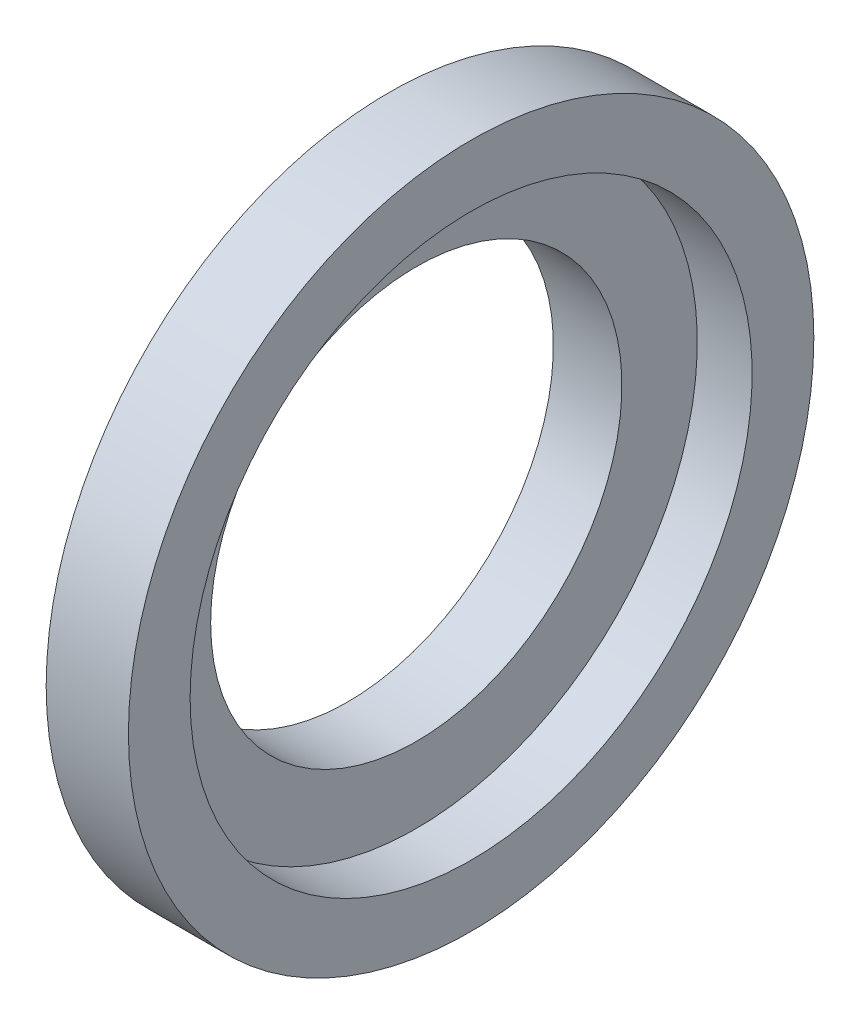
ISO-10303-21;
HEADER;
FILE_DESCRIPTION(('STEP AP214'),'2;1');
FILE_NAME('part.step','',(''),(''),'','','');
FILE_SCHEMA(('AUTOMOTIVE_DESIGN { 1 0 10303 214 1 1 1 1 }'));
ENDSEC;
DATA;
#1=APPLICATION_CONTEXT('core data for automotive mechanical design processes');
#2=APPLICATION_PROTOCOL_DEFINITION('international standard','automotive_design',2000,#1);
#3=PRODUCT_CONTEXT('',#1,'mechanical');
#4=PRODUCT('Part','Part','',(#3));
#5=PRODUCT_RELATED_PRODUCT_CATEGORY('part','',(#4));
#6=PRODUCT_DEFINITION_FORMATION('','',#4);
#7=PRODUCT_DEFINITION_CONTEXT('part definition',#1,'design');
#8=PRODUCT_DEFINITION('design','',#6,#7);
#9=PRODUCT_DEFINITION_SHAPE('','',#8);
#10=(LENGTH_UNIT() NAMED_UNIT(*) SI_UNIT(.MILLI.,.METRE.));
#11=(NAMED_UNIT(*) PLANE_ANGLE_UNIT() SI_UNIT($,.RADIAN.));
#12=(NAMED_UNIT(*) SI_UNIT($,.STERADIAN.) SOLID_ANGLE_UNIT());
#13=UNCERTAINTY_MEASURE_WITH_UNIT(LENGTH_MEASURE(1.E-05),#10,'distance_accuracy_value','');
#14=(GEOMETRIC_REPRESENTATION_CONTEXT(3) GLOBAL_UNCERTAINTY_ASSIGNED_CONTEXT((#13)) GLOBAL_UNIT_ASSIGNED_CONTEXT((#10,
#11,#12)) REPRESENTATION_CONTEXT('',''));
#15=CARTESIAN_POINT('',(0.,0.,0.));
#16=DIRECTION('',(0.,0.,1.));
#17=DIRECTION('',(1.,0.,0.));
#18=AXIS2_PLACEMENT_3D('',#15,#16,#17);
#19=CARTESIAN_POINT('',(-26.5753424657534,36.,0.));
#20=DIRECTION('',(1.,0.,0.));
#21=DIRECTION('',(0.,0.,-1.));
#22=AXIS2_PLACEMENT_3D('',#19,#20,#21);
#23=PLANE('',#22);
#24=CARTESIAN_POINT('',(-26.5753424657534,0.,0.));
#25=DIRECTION('',(-1.,0.,0.));
#26=DIRECTION('',(0.,0.,1.));
#27=AXIS2_PLACEMENT_3D('',#24,#25,#26);
#28=CIRCLE('',#27,30.);
#29=CARTESIAN_POINT('',(-26.5753424657534,0.,30.));
#30=VERTEX_POINT('',#29);
#31=EDGE_CURVE('E10',#30,#30,#28,.T.);
#32=ORIENTED_EDGE('',*,*,#31,.F.);
#33=EDGE_LOOP('',(#32));
#34=FACE_BOUND('',#33,.T.);
#35=CARTESIAN_POINT('',(-26.5753424657534,0.,0.));
#36=DIRECTION('',(-1.,0.,0.));
#37=DIRECTION('',(0.,0.,1.));
#38=AXIS2_PLACEMENT_3D('',#35,#36,#37);
#39=CIRCLE('',#38,36.);
#40=CARTESIAN_POINT('',(-26.5753424657534,0.,36.));
#41=VERTEX_POINT('',#40);
#42=EDGE_CURVE('E56',#41,#41,#39,.T.);
#43=ORIENTED_EDGE('',*,*,#42,.T.);
#44=EDGE_LOOP('',(#43));
#45=FACE_BOUND('',#44,.T.);
#46=ADVANCED_FACE('F31',(#34,#45),#23,.F.);
#47=CARTESIAN_POINT('',(-40.2739726027397,0.,0.));
#48=DIRECTION('',(-1.,0.,0.));
#49=DIRECTION('',(0.,0.,1.));
#50=AXIS2_PLACEMENT_3D('',#47,#48,#49);
#51=CYLINDRICAL_SURFACE('',#50,30.);
#52=CARTESIAN_POINT('',(-16.5753424657534,0.,0.));
#53=DIRECTION('',(-1.,0.,0.));
#54=DIRECTION('',(0.,0.,1.));
#55=AXIS2_PLACEMENT_3D('',#52,#53,#54);
#56=CIRCLE('',#55,30.);
#57=CARTESIAN_POINT('',(-16.5753424657534,0.,30.));
#58=VERTEX_POINT('',#57);
#59=EDGE_CURVE('E37',#58,#58,#56,.T.);
#60=ORIENTED_EDGE('',*,*,#59,.F.);
#61=EDGE_LOOP('',(#60));
#62=FACE_BOUND('',#61,.T.);
#63=ORIENTED_EDGE('',*,*,#31,.T.);
#64=EDGE_LOOP('',(#63));
#65=FACE_BOUND('',#64,.T.);
#66=ADVANCED_FACE('F87',(#62,#65),#51,.F.);
#67=CARTESIAN_POINT('',(-16.5753424657534,30.,0.));
#68=DIRECTION('',(-1.,0.,0.));
#69=DIRECTION('',(0.,0.,1.));
#70=AXIS2_PLACEMENT_3D('',#67,#68,#69);
#71=PLANE('',#70);
#72=CARTESIAN_POINT('',(-16.5753424657534,0.,0.));
#73=DIRECTION('',(-1.,0.,0.));
#74=DIRECTION('',(0.,0.,1.));
#75=AXIS2_PLACEMENT_3D('',#72,#73,#74);
#76=CIRCLE('',#75,41.);
#77=CARTESIAN_POINT('',(-16.5753424657534,0.,41.));
#78=VERTEX_POINT('',#77);
#79=EDGE_CURVE('E41',#78,#78,#76,.T.);
#80=ORIENTED_EDGE('',*,*,#79,.F.);
#81=EDGE_LOOP('',(#80));
#82=FACE_BOUND('',#81,.T.);
#83=ORIENTED_EDGE('',*,*,#59,.T.);
#84=EDGE_LOOP('',(#83));
#85=FACE_BOUND('',#84,.T.);
#86=ADVANCED_FACE('F82',(#82,#85),#71,.F.);
#87=CARTESIAN_POINT('',(-40.2739726027397,0.,0.));
#88=DIRECTION('',(-1.,0.,0.));
#89=DIRECTION('',(0.,0.,1.));
#90=AXIS2_PLACEMENT_3D('',#87,#88,#89);
#91=CYLINDRICAL_SURFACE('',#90,41.);
#92=CARTESIAN_POINT('',(-8.57534246575343,0.,0.));
#93=DIRECTION('',(-1.,0.,0.));
#94=DIRECTION('',(0.,0.,1.));
#95=AXIS2_PLACEMENT_3D('',#92,#93,#94);
#96=CIRCLE('',#95,41.);
#97=CARTESIAN_POINT('',(-8.57534246575343,0.,41.));
#98=VERTEX_POINT('',#97);
#99=EDGE_CURVE('E45',#98,#98,#96,.T.);
#100=ORIENTED_EDGE('',*,*,#99,.F.);
#101=EDGE_LOOP('',(#100));
#102=FACE_BOUND('',#101,.T.);
#103=ORIENTED_EDGE('',*,*,#79,.T.);
#104=EDGE_LOOP('',(#103));
#105=FACE_BOUND('',#104,.T.);
#106=ADVANCED_FACE('F76',(#102,#105),#91,.F.);
#107=CARTESIAN_POINT('',(-8.57534246575343,41.,0.));
#108=DIRECTION('',(-1.,0.,0.));
#109=DIRECTION('',(0.,0.,1.));
#110=AXIS2_PLACEMENT_3D('',#107,#108,#109);
#111=PLANE('',#110);
#112=CARTESIAN_POINT('',(-8.57534246575343,0.,0.));
#113=DIRECTION('',(-1.,0.,0.));
#114=DIRECTION('',(0.,0.,1.));
#115=AXIS2_PLACEMENT_3D('',#112,#113,#114);
#116=CIRCLE('',#115,50.);
#117=CARTESIAN_POINT('',(-8.57534246575343,0.,50.));
#118=VERTEX_POINT('',#117);
#119=EDGE_CURVE('E50',#118,#118,#116,.T.);
#120=ORIENTED_EDGE('',*,*,#119,.F.);
#121=EDGE_LOOP('',(#120));
#122=FACE_BOUND('',#121,.T.);
#123=ORIENTED_EDGE('',*,*,#99,.T.);
#124=EDGE_LOOP('',(#123));
#125=FACE_BOUND('',#124,.T.);
#126=ADVANCED_FACE('F70',(#122,#125),#111,.F.);
#127=CARTESIAN_POINT('',(-40.2739726027397,0.,0.));
#128=DIRECTION('',(-1.,0.,0.));
#129=DIRECTION('',(0.,0.,1.));
#130=AXIS2_PLACEMENT_3D('',#127,#128,#129);
#131=CYLINDRICAL_SURFACE('',#130,50.);
#132=CARTESIAN_POINT('',(-20.5753424657534,0.,0.));
#133=DIRECTION('',(-1.,0.,0.));
#134=DIRECTION('',(0.,0.,1.));
#135=AXIS2_PLACEMENT_3D('',#132,#133,#134);
#136=CIRCLE('',#135,50.);
#137=CARTESIAN_POINT('',(-20.5753424657534,0.,50.));
#138=VERTEX_POINT('',#137);
#139=EDGE_CURVE('E53',#138,#138,#136,.T.);
#140=ORIENTED_EDGE('',*,*,#139,.F.);
#141=EDGE_LOOP('',(#140));
#142=FACE_BOUND('',#141,.T.);
#143=ORIENTED_EDGE('',*,*,#119,.T.);
#144=EDGE_LOOP('',(#143));
#145=FACE_BOUND('',#144,.T.);
#146=ADVANCED_FACE('F64',(#142,#145),#131,.T.);
#147=CARTESIAN_POINT('',(-20.5753424657534,0.,0.));
#148=DIRECTION('',(1.,0.,0.));
#149=DIRECTION('',(0.,0.,-1.));
#150=AXIS2_PLACEMENT_3D('',#147,#148,#149);
#151=CONICAL_SURFACE('',#150,50.,1.16590454050981);
#152=ORIENTED_EDGE('',*,*,#42,.F.);
#153=EDGE_LOOP('',(#152));
#154=FACE_BOUND('',#153,.T.);
#155=ORIENTED_EDGE('',*,*,#139,.T.);
#156=EDGE_LOOP('',(#155));
#157=FACE_BOUND('',#156,.T.);
#158=ADVANCED_FACE('F61',(#154,#157),#151,.T.);
#159=CLOSED_SHELL('',(#46,#66,#86,#106,#126,#146,#158));
#160=MANIFOLD_SOLID_BREP('B2',#159);
#161=ADVANCED_BREP_SHAPE_REPRESENTATION('',(#18,#160),#14);
#162=SHAPE_DEFINITION_REPRESENTATION(#9,#161);
ENDSEC;
END-ISO-10303-21;
